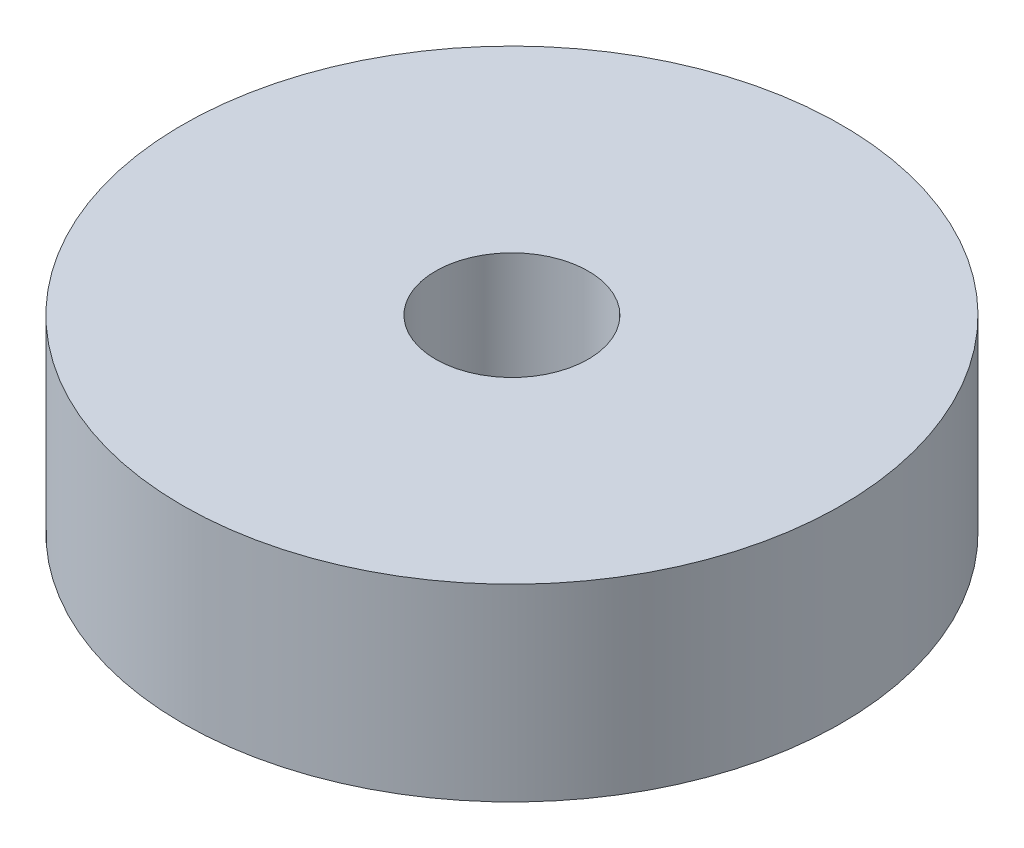
ISO-10303-21;
HEADER;
FILE_DESCRIPTION(('STEP AP214'),'2;1');
FILE_NAME('part.step','',(''),(''),'','','');
FILE_SCHEMA(('AUTOMOTIVE_DESIGN { 1 0 10303 214 1 1 1 1 }'));
ENDSEC;
DATA;
#1=APPLICATION_CONTEXT('core data for automotive mechanical design processes');
#2=APPLICATION_PROTOCOL_DEFINITION('international standard','automotive_design',2000,#1);
#3=PRODUCT_CONTEXT('',#1,'mechanical');
#4=PRODUCT('Part','Part','',(#3));
#5=PRODUCT_RELATED_PRODUCT_CATEGORY('part','',(#4));
#6=PRODUCT_DEFINITION_FORMATION('','',#4);
#7=PRODUCT_DEFINITION_CONTEXT('part definition',#1,'design');
#8=PRODUCT_DEFINITION('design','',#6,#7);
#9=PRODUCT_DEFINITION_SHAPE('','',#8);
#10=(LENGTH_UNIT() NAMED_UNIT(*) SI_UNIT(.MILLI.,.METRE.));
#11=(NAMED_UNIT(*) PLANE_ANGLE_UNIT() SI_UNIT($,.RADIAN.));
#12=(NAMED_UNIT(*) SI_UNIT($,.STERADIAN.) SOLID_ANGLE_UNIT());
#13=UNCERTAINTY_MEASURE_WITH_UNIT(LENGTH_MEASURE(1.E-05),#10,'distance_accuracy_value','');
#14=(GEOMETRIC_REPRESENTATION_CONTEXT(3) GLOBAL_UNCERTAINTY_ASSIGNED_CONTEXT((#13)) GLOBAL_UNIT_ASSIGNED_CONTEXT((#10,
#11,#12)) REPRESENTATION_CONTEXT('',''));
#15=CARTESIAN_POINT('',(0.,0.,0.));
#16=DIRECTION('',(0.,0.,1.));
#17=DIRECTION('',(1.,0.,0.));
#18=AXIS2_PLACEMENT_3D('',#15,#16,#17);
#19=CARTESIAN_POINT('',(0.,-108.45,0.));
#20=DIRECTION('',(0.,-1.,0.));
#21=DIRECTION('',(0.,0.,-1.));
#22=AXIS2_PLACEMENT_3D('',#19,#20,#21);
#23=CYLINDRICAL_SURFACE('',#22,3.25);
#24=CARTESIAN_POINT('',(0.,-118.45,0.));
#25=DIRECTION('',(0.,1.,0.));
#26=DIRECTION('',(0.,0.,1.));
#27=AXIS2_PLACEMENT_3D('',#24,#25,#26);
#28=CIRCLE('',#27,3.25);
#29=CARTESIAN_POINT('',(0.,-118.45,3.25));
#30=VERTEX_POINT('',#29);
#31=EDGE_CURVE('E49',#30,#30,#28,.T.);
#32=ORIENTED_EDGE('',*,*,#31,.F.);
#33=EDGE_LOOP('',(#32));
#34=FACE_BOUND('',#33,.T.);
#35=CARTESIAN_POINT('',(0.,-116.45,0.));
#36=DIRECTION('',(0.,1.,0.));
#37=DIRECTION('',(0.,0.,1.));
#38=AXIS2_PLACEMENT_3D('',#35,#36,#37);
#39=CIRCLE('',#38,3.25);
#40=CARTESIAN_POINT('',(0.,-116.45,3.25));
#41=VERTEX_POINT('',#40);
#42=EDGE_CURVE('E40',#41,#41,#39,.T.);
#43=ORIENTED_EDGE('',*,*,#42,.T.);
#44=EDGE_LOOP('',(#43));
#45=FACE_BOUND('',#44,.T.);
#46=ADVANCED_FACE('F36',(#34,#45),#23,.F.);
#47=CARTESIAN_POINT('',(0.,-108.45,0.));
#48=DIRECTION('',(0.,1.,0.));
#49=DIRECTION('',(0.,0.,1.));
#50=AXIS2_PLACEMENT_3D('',#47,#48,#49);
#51=PLANE('',#50);
#52=CARTESIAN_POINT('',(0.,-108.45,0.));
#53=DIRECTION('',(0.,1.,0.));
#54=DIRECTION('',(0.,0.,1.));
#55=AXIS2_PLACEMENT_3D('',#52,#53,#54);
#56=CIRCLE('',#55,4.05);
#57=CARTESIAN_POINT('',(0.,-108.45,4.05));
#58=VERTEX_POINT('',#57);
#59=EDGE_CURVE('E56',#58,#58,#56,.T.);
#60=ORIENTED_EDGE('',*,*,#59,.F.);
#61=EDGE_LOOP('',(#60));
#62=FACE_BOUND('',#61,.T.);
#63=CARTESIAN_POINT('',(0.,-108.45,0.));
#64=DIRECTION('',(0.,1.,0.));
#65=DIRECTION('',(0.,0.,1.));
#66=AXIS2_PLACEMENT_3D('',#63,#64,#65);
#67=CIRCLE('',#66,17.475);
#68=CARTESIAN_POINT('',(0.,-108.45,17.475));
#69=VERTEX_POINT('',#68);
#70=EDGE_CURVE('E11',#69,#69,#67,.T.);
#71=ORIENTED_EDGE('',*,*,#70,.T.);
#72=EDGE_LOOP('',(#71));
#73=FACE_BOUND('',#72,.T.);
#74=ADVANCED_FACE('F62',(#62,#73),#51,.T.);
#75=CARTESIAN_POINT('',(0.,-118.45,0.));
#76=DIRECTION('',(0.,1.,0.));
#77=DIRECTION('',(0.,0.,1.));
#78=AXIS2_PLACEMENT_3D('',#75,#76,#77);
#79=PLANE('',#78);
#80=CARTESIAN_POINT('',(0.,-118.45,0.));
#81=DIRECTION('',(0.,1.,0.));
#82=DIRECTION('',(0.,0.,1.));
#83=AXIS2_PLACEMENT_3D('',#80,#81,#82);
#84=CIRCLE('',#83,17.475);
#85=CARTESIAN_POINT('',(0.,-118.45,17.475));
#86=VERTEX_POINT('',#85);
#87=EDGE_CURVE('E44',#86,#86,#84,.T.);
#88=ORIENTED_EDGE('',*,*,#87,.F.);
#89=EDGE_LOOP('',(#88));
#90=FACE_BOUND('',#89,.T.);
#91=ORIENTED_EDGE('',*,*,#31,.T.);
#92=EDGE_LOOP('',(#91));
#93=FACE_BOUND('',#92,.T.);
#94=ADVANCED_FACE('F64',(#90,#93),#79,.F.);
#95=CARTESIAN_POINT('',(0.,-108.45,0.));
#96=DIRECTION('',(0.,-1.,0.));
#97=DIRECTION('',(0.,0.,-1.));
#98=AXIS2_PLACEMENT_3D('',#95,#96,#97);
#99=CYLINDRICAL_SURFACE('',#98,17.475);
#100=ORIENTED_EDGE('',*,*,#70,.F.);
#101=EDGE_LOOP('',(#100));
#102=FACE_BOUND('',#101,.T.);
#103=ORIENTED_EDGE('',*,*,#87,.T.);
#104=EDGE_LOOP('',(#103));
#105=FACE_BOUND('',#104,.T.);
#106=ADVANCED_FACE('F38',(#102,#105),#99,.T.);
#107=CARTESIAN_POINT('',(0.,-129.905129855222,0.));
#108=DIRECTION('',(0.,1.,0.));
#109=DIRECTION('',(0.,0.,1.));
#110=AXIS2_PLACEMENT_3D('',#107,#108,#109);
#111=CYLINDRICAL_SURFACE('',#110,4.05);
#112=CARTESIAN_POINT('',(0.,-116.45,0.));
#113=DIRECTION('',(0.,1.,0.));
#114=DIRECTION('',(0.,0.,1.));
#115=AXIS2_PLACEMENT_3D('',#112,#113,#114);
#116=CIRCLE('',#115,4.05);
#117=CARTESIAN_POINT('',(0.,-116.45,4.05));
#118=VERTEX_POINT('',#117);
#119=EDGE_CURVE('E53',#118,#118,#116,.F.);
#120=CARTESIAN_POINT('',(0.,-116.45,4.05));
#121=CARTESIAN_POINT('',(0.,-116.366666666667,4.05));
#122=CARTESIAN_POINT('',(0.,-116.283333333333,4.05));
#123=CARTESIAN_POINT('',(0.,-116.116666666667,4.05));
#124=CARTESIAN_POINT('',(0.,-116.033333333333,4.05));
#125=CARTESIAN_POINT('',(0.,-115.866666666667,4.05));
#126=CARTESIAN_POINT('',(0.,-115.783333333333,4.05));
#127=CARTESIAN_POINT('',(0.,-115.616666666667,4.05));
#128=CARTESIAN_POINT('',(0.,-115.533333333333,4.05));
#129=CARTESIAN_POINT('',(0.,-115.366666666667,4.05));
#130=CARTESIAN_POINT('',(0.,-115.283333333333,4.05));
#131=CARTESIAN_POINT('',(0.,-115.116666666667,4.05));
#132=CARTESIAN_POINT('',(0.,-115.033333333333,4.05));
#133=CARTESIAN_POINT('',(0.,-114.866666666667,4.05));
#134=CARTESIAN_POINT('',(0.,-114.783333333333,4.05));
#135=CARTESIAN_POINT('',(0.,-114.616666666667,4.05));
#136=CARTESIAN_POINT('',(0.,-114.533333333333,4.05));
#137=CARTESIAN_POINT('',(0.,-114.366666666667,4.05));
#138=CARTESIAN_POINT('',(0.,-114.283333333333,4.05));
#139=CARTESIAN_POINT('',(0.,-114.116666666667,4.05));
#140=CARTESIAN_POINT('',(0.,-114.033333333333,4.05));
#141=CARTESIAN_POINT('',(0.,-113.866666666667,4.05));
#142=CARTESIAN_POINT('',(0.,-113.783333333333,4.05));
#143=CARTESIAN_POINT('',(0.,-113.616666666667,4.05));
#144=CARTESIAN_POINT('',(0.,-113.533333333333,4.05));
#145=CARTESIAN_POINT('',(0.,-113.366666666667,4.05));
#146=CARTESIAN_POINT('',(0.,-113.283333333333,4.05));
#147=CARTESIAN_POINT('',(0.,-113.116666666667,4.05));
#148=CARTESIAN_POINT('',(0.,-113.033333333333,4.05));
#149=CARTESIAN_POINT('',(0.,-112.866666666667,4.05));
#150=CARTESIAN_POINT('',(0.,-112.783333333333,4.05));
#151=CARTESIAN_POINT('',(0.,-112.616666666667,4.05));
#152=CARTESIAN_POINT('',(0.,-112.533333333333,4.05));
#153=CARTESIAN_POINT('',(0.,-112.366666666667,4.05));
#154=CARTESIAN_POINT('',(0.,-112.283333333333,4.05));
#155=CARTESIAN_POINT('',(0.,-112.116666666667,4.05));
#156=CARTESIAN_POINT('',(0.,-112.033333333333,4.05));
#157=CARTESIAN_POINT('',(0.,-111.866666666667,4.05));
#158=CARTESIAN_POINT('',(0.,-111.783333333333,4.05));
#159=CARTESIAN_POINT('',(0.,-111.616666666667,4.05));
#160=CARTESIAN_POINT('',(0.,-111.533333333333,4.05));
#161=CARTESIAN_POINT('',(0.,-111.366666666667,4.05));
#162=CARTESIAN_POINT('',(0.,-111.283333333333,4.05));
#163=CARTESIAN_POINT('',(0.,-111.116666666667,4.05));
#164=CARTESIAN_POINT('',(0.,-111.033333333333,4.05));
#165=CARTESIAN_POINT('',(0.,-110.866666666667,4.05));
#166=CARTESIAN_POINT('',(0.,-110.783333333333,4.05));
#167=CARTESIAN_POINT('',(0.,-110.616666666667,4.05));
#168=CARTESIAN_POINT('',(0.,-110.533333333333,4.05));
#169=CARTESIAN_POINT('',(0.,-110.366666666667,4.05));
#170=CARTESIAN_POINT('',(0.,-110.283333333333,4.05));
#171=CARTESIAN_POINT('',(0.,-110.116666666667,4.05));
#172=CARTESIAN_POINT('',(0.,-110.033333333333,4.05));
#173=CARTESIAN_POINT('',(0.,-109.866666666667,4.05));
#174=CARTESIAN_POINT('',(0.,-109.783333333333,4.05));
#175=CARTESIAN_POINT('',(0.,-109.616666666667,4.05));
#176=CARTESIAN_POINT('',(0.,-109.533333333333,4.05));
#177=CARTESIAN_POINT('',(0.,-109.366666666667,4.05));
#178=CARTESIAN_POINT('',(0.,-109.283333333333,4.05));
#179=CARTESIAN_POINT('',(0.,-109.116666666667,4.05));
#180=CARTESIAN_POINT('',(0.,-109.033333333333,4.05));
#181=CARTESIAN_POINT('',(0.,-108.866666666667,4.05));
#182=CARTESIAN_POINT('',(0.,-108.783333333333,4.05));
#183=CARTESIAN_POINT('',(0.,-108.616666666667,4.05));
#184=CARTESIAN_POINT('',(0.,-108.533333333333,4.05));
#185=CARTESIAN_POINT('',(0.,-108.45,4.05));
#186=B_SPLINE_CURVE_WITH_KNOTS('',3,(#120,#121,#122,#123,#124,#125,#126,#127,#128,#129,#130,
#131,#132,#133,#134,#135,#136,#137,#138,#139,#140,#141,#142,#143,#144,#145,#146,#147,#148,#149,
#150,#151,#152,#153,#154,#155,#156,#157,#158,#159,#160,#161,#162,#163,#164,#165,#166,#167,#168,
#169,#170,#171,#172,#173,#174,#175,#176,#177,#178,#179,#180,#181,#182,#183,#184,#185),
.UNSPECIFIED.,.F.,.F.,(4,2,2,2,2,2,2,2,2,2,2,2,2,2,2,2,2,2,2,2,2,2,2,2,2,2,2,2,2,2,2,2,4),(0.,
0.25,0.5,0.750000000000001,1.,1.25,1.5,1.75,2.,2.25,2.5,2.75,3.,3.25,3.5,3.75,4.,4.25,4.5,4.75,
5.,5.25,5.50000000000001,5.75000000000001,6.00000000000001,6.25000000000001,6.50000000000001,
6.75000000000001,7.00000000000001,7.25000000000001,7.50000000000001,7.75000000000001,
8.00000000000001),.UNSPECIFIED.);
#187=EDGE_CURVE('BSEAM60',#118,#58,#186,.T.);
#188=ORIENTED_EDGE('',*,*,#119,.T.);
#189=ORIENTED_EDGE('',*,*,#59,.T.);
#190=ORIENTED_EDGE('',*,*,#187,.T.);
#191=ORIENTED_EDGE('',*,*,#187,.F.);
#192=EDGE_LOOP('',(#188,#190,#189,#191));
#193=FACE_BOUND('',#192,.T.);
#194=ADVANCED_FACE('F60',(#193),#111,.F.);
#195=CARTESIAN_POINT('',(0.,-116.45,0.));
#196=DIRECTION('',(0.,1.,0.));
#197=DIRECTION('',(0.,0.,1.));
#198=AXIS2_PLACEMENT_3D('',#195,#196,#197);
#199=PLANE('',#198);
#200=ORIENTED_EDGE('',*,*,#42,.F.);
#201=EDGE_LOOP('',(#200));
#202=FACE_BOUND('',#201,.T.);
#203=ORIENTED_EDGE('',*,*,#119,.F.);
#204=EDGE_LOOP('',(#203));
#205=FACE_BOUND('',#204,.T.);
#206=ADVANCED_FACE('F76',(#202,#205),#199,.T.);
#207=CLOSED_SHELL('',(#46,#74,#94,#106,#194,#206));
#208=MANIFOLD_SOLID_BREP('B2',#207);
#209=ADVANCED_BREP_SHAPE_REPRESENTATION('',(#18,#208),#14);
#210=SHAPE_DEFINITION_REPRESENTATION(#9,#209);
ENDSEC;
END-ISO-10303-21;
